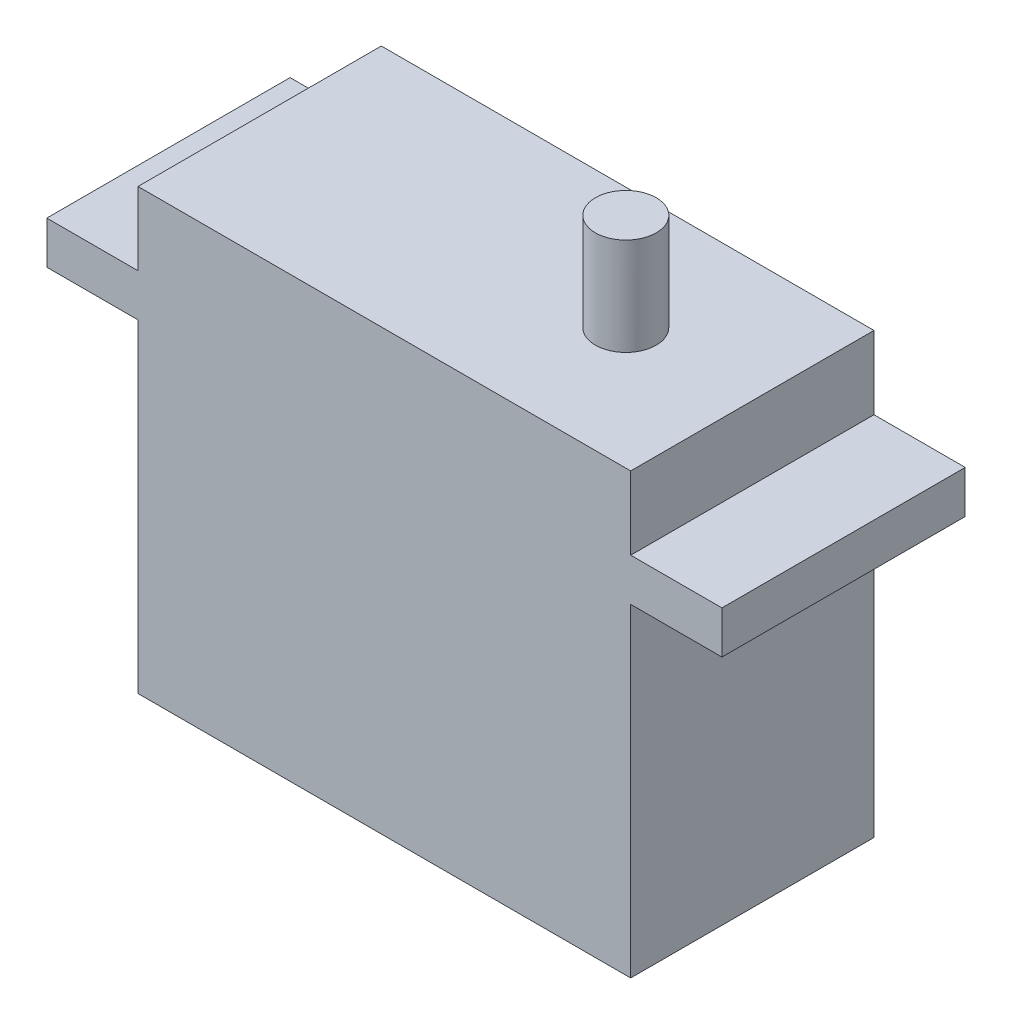
ISO-10303-21;
HEADER;
FILE_DESCRIPTION(('STEP AP214'),'2;1');
FILE_NAME('part.step','',(''),(''),'','','');
FILE_SCHEMA(('AUTOMOTIVE_DESIGN { 1 0 10303 214 1 1 1 1 }'));
ENDSEC;
DATA;
#1=APPLICATION_CONTEXT('core data for automotive mechanical design processes');
#2=APPLICATION_PROTOCOL_DEFINITION('international standard','automotive_design',2000,#1);
#3=PRODUCT_CONTEXT('',#1,'mechanical');
#4=PRODUCT('Part','Part','',(#3));
#5=PRODUCT_RELATED_PRODUCT_CATEGORY('part','',(#4));
#6=PRODUCT_DEFINITION_FORMATION('','',#4);
#7=PRODUCT_DEFINITION_CONTEXT('part definition',#1,'design');
#8=PRODUCT_DEFINITION('design','',#6,#7);
#9=PRODUCT_DEFINITION_SHAPE('','',#8);
#10=(LENGTH_UNIT() NAMED_UNIT(*) SI_UNIT(.MILLI.,.METRE.));
#11=(NAMED_UNIT(*) PLANE_ANGLE_UNIT() SI_UNIT($,.RADIAN.));
#12=(NAMED_UNIT(*) SI_UNIT($,.STERADIAN.) SOLID_ANGLE_UNIT());
#13=UNCERTAINTY_MEASURE_WITH_UNIT(LENGTH_MEASURE(1.E-05),#10,'distance_accuracy_value','');
#14=(GEOMETRIC_REPRESENTATION_CONTEXT(3) GLOBAL_UNCERTAINTY_ASSIGNED_CONTEXT((#13)) GLOBAL_UNIT_ASSIGNED_CONTEXT((#10,
#11,#12)) REPRESENTATION_CONTEXT('',''));
#15=CARTESIAN_POINT('',(0.,0.,0.));
#16=DIRECTION('',(0.,0.,1.));
#17=DIRECTION('',(1.,0.,0.));
#18=AXIS2_PLACEMENT_3D('',#15,#16,#17);
#19=CARTESIAN_POINT('',(-27.75,36.1,10.));
#20=DIRECTION('',(1.,0.,0.));
#21=DIRECTION('',(0.,0.,-1.));
#22=AXIS2_PLACEMENT_3D('',#19,#20,#21);
#23=PLANE('',#22);
#24=DIRECTION('',(0.,0.,1.));
#25=VECTOR('',#24,1.);
#26=CARTESIAN_POINT('',(-27.75,30.1,-10.));
#27=LINE('',#26,#25);
#28=CARTESIAN_POINT('',(-27.75,30.1,-10.));
#29=VERTEX_POINT('',#28);
#30=CARTESIAN_POINT('',(-27.75,30.1,10.));
#31=VERTEX_POINT('',#30);
#32=EDGE_CURVE('E206',#29,#31,#27,.T.);
#33=ORIENTED_EDGE('',*,*,#32,.F.);
#34=DIRECTION('',(0.,-1.,0.));
#35=VECTOR('',#34,1.);
#36=CARTESIAN_POINT('',(-27.75,36.1,-10.));
#37=LINE('',#36,#35);
#38=CARTESIAN_POINT('',(-27.75,26.6,-10.));
#39=VERTEX_POINT('',#38);
#40=EDGE_CURVE('E144',#29,#39,#37,.T.);
#41=ORIENTED_EDGE('',*,*,#40,.T.);
#42=DIRECTION('',(0.,0.,-1.));
#43=VECTOR('',#42,1.);
#44=CARTESIAN_POINT('',(-27.75,26.6,-10.));
#45=LINE('',#44,#43);
#46=CARTESIAN_POINT('',(-27.75,26.6,10.));
#47=VERTEX_POINT('',#46);
#48=EDGE_CURVE('E173',#47,#39,#45,.T.);
#49=ORIENTED_EDGE('',*,*,#48,.F.);
#50=DIRECTION('',(0.,-1.,0.));
#51=VECTOR('',#50,1.);
#52=CARTESIAN_POINT('',(-27.75,36.1,10.));
#53=LINE('',#52,#51);
#54=EDGE_CURVE('E145',#31,#47,#53,.T.);
#55=ORIENTED_EDGE('',*,*,#54,.F.);
#56=EDGE_LOOP('',(#33,#41,#49,#55));
#57=FACE_BOUND('',#56,.T.);
#58=ADVANCED_FACE('F33',(#57),#23,.F.);
#59=CARTESIAN_POINT('',(27.75,36.1,10.));
#60=DIRECTION('',(-1.,0.,0.));
#61=DIRECTION('',(0.,0.,1.));
#62=AXIS2_PLACEMENT_3D('',#59,#60,#61);
#63=PLANE('',#62);
#64=DIRECTION('',(0.,-1.,0.));
#65=VECTOR('',#64,1.);
#66=CARTESIAN_POINT('',(27.75,36.1,-10.));
#67=LINE('',#66,#65);
#68=CARTESIAN_POINT('',(27.75,30.1,-10.));
#69=VERTEX_POINT('',#68);
#70=CARTESIAN_POINT('',(27.75,26.6,-10.));
#71=VERTEX_POINT('',#70);
#72=EDGE_CURVE('E41',#69,#71,#67,.T.);
#73=ORIENTED_EDGE('',*,*,#72,.F.);
#74=DIRECTION('',(0.,0.,-1.));
#75=VECTOR('',#74,1.);
#76=CARTESIAN_POINT('',(27.75,30.1,-10.));
#77=LINE('',#76,#75);
#78=CARTESIAN_POINT('',(27.75,30.1,10.));
#79=VERTEX_POINT('',#78);
#80=EDGE_CURVE('E122',#79,#69,#77,.T.);
#81=ORIENTED_EDGE('',*,*,#80,.F.);
#82=DIRECTION('',(0.,-1.,0.));
#83=VECTOR('',#82,1.);
#84=CARTESIAN_POINT('',(27.75,36.1,10.));
#85=LINE('',#84,#83);
#86=CARTESIAN_POINT('',(27.75,26.6,10.));
#87=VERTEX_POINT('',#86);
#88=EDGE_CURVE('E149',#79,#87,#85,.T.);
#89=ORIENTED_EDGE('',*,*,#88,.T.);
#90=DIRECTION('',(0.,0.,1.));
#91=VECTOR('',#90,1.);
#92=CARTESIAN_POINT('',(27.75,26.6,10.));
#93=LINE('',#92,#91);
#94=EDGE_CURVE('E143',#71,#87,#93,.T.);
#95=ORIENTED_EDGE('',*,*,#94,.F.);
#96=EDGE_LOOP('',(#73,#81,#89,#95));
#97=FACE_BOUND('',#96,.T.);
#98=ADVANCED_FACE('F35',(#97),#63,.F.);
#99=CARTESIAN_POINT('',(-27.75,36.1,-10.));
#100=DIRECTION('',(0.,0.,1.));
#101=DIRECTION('',(1.,0.,0.));
#102=AXIS2_PLACEMENT_3D('',#99,#100,#101);
#103=PLANE('',#102);
#104=DIRECTION('',(-1.,0.,0.));
#105=VECTOR('',#104,1.);
#106=CARTESIAN_POINT('',(-27.75,36.1,-10.));
#107=LINE('',#106,#105);
#108=CARTESIAN_POINT('',(20.25,36.1,-10.));
#109=VERTEX_POINT('',#108);
#110=CARTESIAN_POINT('',(-20.25,36.1,-10.));
#111=VERTEX_POINT('',#110);
#112=EDGE_CURVE('E155',#109,#111,#107,.T.);
#113=ORIENTED_EDGE('',*,*,#112,.F.);
#114=DIRECTION('',(0.,1.,0.));
#115=VECTOR('',#114,1.);
#116=CARTESIAN_POINT('',(20.25,30.1,-10.));
#117=LINE('',#116,#115);
#118=CARTESIAN_POINT('',(20.25,30.1,-10.));
#119=VERTEX_POINT('',#118);
#120=EDGE_CURVE('E56',#119,#109,#117,.T.);
#121=ORIENTED_EDGE('',*,*,#120,.F.);
#122=DIRECTION('',(-1.,0.,0.));
#123=VECTOR('',#122,1.);
#124=CARTESIAN_POINT('',(27.75,30.1,-10.));
#125=LINE('',#124,#123);
#126=EDGE_CURVE('E126',#69,#119,#125,.T.);
#127=ORIENTED_EDGE('',*,*,#126,.F.);
#128=ORIENTED_EDGE('',*,*,#72,.T.);
#129=DIRECTION('',(1.,0.,0.));
#130=VECTOR('',#129,1.);
#131=CARTESIAN_POINT('',(27.75,26.6,-10.));
#132=LINE('',#131,#130);
#133=CARTESIAN_POINT('',(20.25,26.6,-10.));
#134=VERTEX_POINT('',#133);
#135=EDGE_CURVE('E187',#134,#71,#132,.T.);
#136=ORIENTED_EDGE('',*,*,#135,.F.);
#137=DIRECTION('',(0.,-1.,0.));
#138=VECTOR('',#137,1.);
#139=CARTESIAN_POINT('',(20.25,26.6,-10.));
#140=LINE('',#139,#138);
#141=CARTESIAN_POINT('',(20.25,0.,-10.));
#142=VERTEX_POINT('',#141);
#143=EDGE_CURVE('E159',#134,#142,#140,.T.);
#144=ORIENTED_EDGE('',*,*,#143,.T.);
#145=DIRECTION('',(-1.,0.,0.));
#146=VECTOR('',#145,1.);
#147=CARTESIAN_POINT('',(-27.75,0.,-10.));
#148=LINE('',#147,#146);
#149=CARTESIAN_POINT('',(-20.25,0.,-10.));
#150=VERTEX_POINT('',#149);
#151=EDGE_CURVE('E156',#142,#150,#148,.T.);
#152=ORIENTED_EDGE('',*,*,#151,.T.);
#153=DIRECTION('',(0.,-1.,0.));
#154=VECTOR('',#153,1.);
#155=CARTESIAN_POINT('',(-20.25,26.6,-10.));
#156=LINE('',#155,#154);
#157=CARTESIAN_POINT('',(-20.25,26.6,-10.));
#158=VERTEX_POINT('',#157);
#159=EDGE_CURVE('E164',#158,#150,#156,.T.);
#160=ORIENTED_EDGE('',*,*,#159,.F.);
#161=DIRECTION('',(1.,0.,0.));
#162=VECTOR('',#161,1.);
#163=CARTESIAN_POINT('',(-27.75,26.6,-10.));
#164=LINE('',#163,#162);
#165=EDGE_CURVE('E180',#39,#158,#164,.T.);
#166=ORIENTED_EDGE('',*,*,#165,.F.);
#167=ORIENTED_EDGE('',*,*,#40,.F.);
#168=DIRECTION('',(-1.,0.,0.));
#169=VECTOR('',#168,1.);
#170=CARTESIAN_POINT('',(-27.75,30.1,-10.));
#171=LINE('',#170,#169);
#172=CARTESIAN_POINT('',(-20.25,30.1,-10.));
#173=VERTEX_POINT('',#172);
#174=EDGE_CURVE('E201',#173,#29,#171,.T.);
#175=ORIENTED_EDGE('',*,*,#174,.F.);
#176=DIRECTION('',(0.,1.,0.));
#177=VECTOR('',#176,1.);
#178=CARTESIAN_POINT('',(-20.25,30.1,-10.));
#179=LINE('',#178,#177);
#180=EDGE_CURVE('E200',#173,#111,#179,.T.);
#181=ORIENTED_EDGE('',*,*,#180,.T.);
#182=EDGE_LOOP('',(#113,#121,#127,#128,#136,#144,#152,#160,#166,#167,#175,#181));
#183=FACE_BOUND('',#182,.T.);
#184=ADVANCED_FACE('F136',(#183),#103,.F.);
#185=CARTESIAN_POINT('',(-27.75,36.1,10.));
#186=DIRECTION('',(0.,0.,-1.));
#187=DIRECTION('',(-1.,0.,0.));
#188=AXIS2_PLACEMENT_3D('',#185,#186,#187);
#189=PLANE('',#188);
#190=DIRECTION('',(1.,0.,0.));
#191=VECTOR('',#190,1.);
#192=CARTESIAN_POINT('',(27.75,30.1,10.));
#193=LINE('',#192,#191);
#194=CARTESIAN_POINT('',(20.25,30.1,10.));
#195=VERTEX_POINT('',#194);
#196=EDGE_CURVE('E128',#195,#79,#193,.T.);
#197=ORIENTED_EDGE('',*,*,#196,.F.);
#198=DIRECTION('',(0.,1.,0.));
#199=VECTOR('',#198,1.);
#200=CARTESIAN_POINT('',(20.25,30.1,10.));
#201=LINE('',#200,#199);
#202=CARTESIAN_POINT('',(20.25,36.1,10.));
#203=VERTEX_POINT('',#202);
#204=EDGE_CURVE('E174',#195,#203,#201,.T.);
#205=ORIENTED_EDGE('',*,*,#204,.T.);
#206=DIRECTION('',(1.,0.,0.));
#207=VECTOR('',#206,1.);
#208=CARTESIAN_POINT('',(-27.75,36.1,10.));
#209=LINE('',#208,#207);
#210=CARTESIAN_POINT('',(-20.25,36.1,10.));
#211=VERTEX_POINT('',#210);
#212=EDGE_CURVE('E151',#211,#203,#209,.T.);
#213=ORIENTED_EDGE('',*,*,#212,.F.);
#214=DIRECTION('',(0.,1.,0.));
#215=VECTOR('',#214,1.);
#216=CARTESIAN_POINT('',(-20.25,30.1,10.));
#217=LINE('',#216,#215);
#218=CARTESIAN_POINT('',(-20.25,30.1,10.));
#219=VERTEX_POINT('',#218);
#220=EDGE_CURVE('E48',#219,#211,#217,.T.);
#221=ORIENTED_EDGE('',*,*,#220,.F.);
#222=DIRECTION('',(1.,0.,0.));
#223=VECTOR('',#222,1.);
#224=CARTESIAN_POINT('',(-27.75,30.1,10.));
#225=LINE('',#224,#223);
#226=EDGE_CURVE('E212',#31,#219,#225,.T.);
#227=ORIENTED_EDGE('',*,*,#226,.F.);
#228=ORIENTED_EDGE('',*,*,#54,.T.);
#229=DIRECTION('',(-1.,0.,0.));
#230=VECTOR('',#229,1.);
#231=CARTESIAN_POINT('',(-27.75,26.6,10.));
#232=LINE('',#231,#230);
#233=CARTESIAN_POINT('',(-20.25,26.6,10.));
#234=VERTEX_POINT('',#233);
#235=EDGE_CURVE('E167',#234,#47,#232,.T.);
#236=ORIENTED_EDGE('',*,*,#235,.F.);
#237=DIRECTION('',(0.,-1.,0.));
#238=VECTOR('',#237,1.);
#239=CARTESIAN_POINT('',(-20.25,26.6,10.));
#240=LINE('',#239,#238);
#241=CARTESIAN_POINT('',(-20.25,0.,10.));
#242=VERTEX_POINT('',#241);
#243=EDGE_CURVE('E166',#234,#242,#240,.T.);
#244=ORIENTED_EDGE('',*,*,#243,.T.);
#245=DIRECTION('',(1.,0.,0.));
#246=VECTOR('',#245,1.);
#247=CARTESIAN_POINT('',(-27.75,0.,10.));
#248=LINE('',#247,#246);
#249=CARTESIAN_POINT('',(20.25,0.,10.));
#250=VERTEX_POINT('',#249);
#251=EDGE_CURVE('E152',#242,#250,#248,.T.);
#252=ORIENTED_EDGE('',*,*,#251,.T.);
#253=DIRECTION('',(0.,-1.,0.));
#254=VECTOR('',#253,1.);
#255=CARTESIAN_POINT('',(20.25,26.6,10.));
#256=LINE('',#255,#254);
#257=CARTESIAN_POINT('',(20.25,26.6,10.));
#258=VERTEX_POINT('',#257);
#259=EDGE_CURVE('E185',#258,#250,#256,.T.);
#260=ORIENTED_EDGE('',*,*,#259,.F.);
#261=DIRECTION('',(-1.,0.,0.));
#262=VECTOR('',#261,1.);
#263=CARTESIAN_POINT('',(27.75,26.6,10.));
#264=LINE('',#263,#262);
#265=EDGE_CURVE('E195',#87,#258,#264,.T.);
#266=ORIENTED_EDGE('',*,*,#265,.F.);
#267=ORIENTED_EDGE('',*,*,#88,.F.);
#268=EDGE_LOOP('',(#197,#205,#213,#221,#227,#228,#236,#244,#252,#260,#266,#267));
#269=FACE_BOUND('',#268,.T.);
#270=ADVANCED_FACE('F237',(#269),#189,.F.);
#271=CARTESIAN_POINT('',(0.,36.1,0.));
#272=DIRECTION('',(0.,-1.,0.));
#273=DIRECTION('',(0.,0.,-1.));
#274=AXIS2_PLACEMENT_3D('',#271,#272,#273);
#275=PLANE('',#274);
#276=CARTESIAN_POINT('',(9.85,36.1,0.));
#277=DIRECTION('',(0.,-1.,0.));
#278=DIRECTION('',(0.,0.,-1.));
#279=AXIS2_PLACEMENT_3D('',#276,#277,#278);
#280=CIRCLE('',#279,2.5);
#281=CARTESIAN_POINT('',(9.85,36.1,-2.5));
#282=VERTEX_POINT('',#281);
#283=EDGE_CURVE('E11',#282,#282,#280,.F.);
#284=ORIENTED_EDGE('',*,*,#283,.F.);
#285=EDGE_LOOP('',(#284));
#286=FACE_BOUND('',#285,.T.);
#287=ORIENTED_EDGE('',*,*,#212,.T.);
#288=DIRECTION('',(0.,0.,1.));
#289=VECTOR('',#288,1.);
#290=CARTESIAN_POINT('',(20.25,36.1,-10.));
#291=LINE('',#290,#289);
#292=EDGE_CURVE('E132',#109,#203,#291,.T.);
#293=ORIENTED_EDGE('',*,*,#292,.F.);
#294=ORIENTED_EDGE('',*,*,#112,.T.);
#295=DIRECTION('',(0.,0.,-1.));
#296=VECTOR('',#295,1.);
#297=CARTESIAN_POINT('',(-20.25,36.1,-10.));
#298=LINE('',#297,#296);
#299=EDGE_CURVE('E204',#211,#111,#298,.T.);
#300=ORIENTED_EDGE('',*,*,#299,.F.);
#301=EDGE_LOOP('',(#287,#293,#294,#300));
#302=FACE_BOUND('',#301,.T.);
#303=ADVANCED_FACE('F233',(#286,#302),#275,.F.);
#304=CARTESIAN_POINT('',(0.,0.,0.));
#305=DIRECTION('',(0.,-1.,0.));
#306=DIRECTION('',(0.,0.,-1.));
#307=AXIS2_PLACEMENT_3D('',#304,#305,#306);
#308=PLANE('',#307);
#309=DIRECTION('',(0.,0.,-1.));
#310=VECTOR('',#309,1.);
#311=CARTESIAN_POINT('',(20.25,0.,10.));
#312=LINE('',#311,#310);
#313=EDGE_CURVE('E170',#250,#142,#312,.T.);
#314=ORIENTED_EDGE('',*,*,#313,.F.);
#315=ORIENTED_EDGE('',*,*,#251,.F.);
#316=DIRECTION('',(0.,0.,1.));
#317=VECTOR('',#316,1.);
#318=CARTESIAN_POINT('',(-20.25,0.,-10.));
#319=LINE('',#318,#317);
#320=EDGE_CURVE('E171',#150,#242,#319,.T.);
#321=ORIENTED_EDGE('',*,*,#320,.F.);
#322=ORIENTED_EDGE('',*,*,#151,.F.);
#323=EDGE_LOOP('',(#314,#315,#321,#322));
#324=FACE_BOUND('',#323,.T.);
#325=ADVANCED_FACE('F236',(#324),#308,.T.);
#326=CARTESIAN_POINT('',(-20.25,26.6,-10.));
#327=DIRECTION('',(1.,0.,0.));
#328=DIRECTION('',(0.,0.,-1.));
#329=AXIS2_PLACEMENT_3D('',#326,#327,#328);
#330=PLANE('',#329);
#331=ORIENTED_EDGE('',*,*,#320,.T.);
#332=ORIENTED_EDGE('',*,*,#243,.F.);
#333=DIRECTION('',(0.,0.,1.));
#334=VECTOR('',#333,1.);
#335=CARTESIAN_POINT('',(-20.25,26.6,-10.));
#336=LINE('',#335,#334);
#337=EDGE_CURVE('E177',#158,#234,#336,.T.);
#338=ORIENTED_EDGE('',*,*,#337,.F.);
#339=ORIENTED_EDGE('',*,*,#159,.T.);
#340=EDGE_LOOP('',(#331,#332,#338,#339));
#341=FACE_BOUND('',#340,.T.);
#342=ADVANCED_FACE('F282',(#341),#330,.F.);
#343=CARTESIAN_POINT('',(0.,26.6,0.));
#344=DIRECTION('',(0.,1.,0.));
#345=DIRECTION('',(0.,0.,1.));
#346=AXIS2_PLACEMENT_3D('',#343,#344,#345);
#347=PLANE('',#346);
#348=ORIENTED_EDGE('',*,*,#48,.T.);
#349=ORIENTED_EDGE('',*,*,#165,.T.);
#350=ORIENTED_EDGE('',*,*,#337,.T.);
#351=ORIENTED_EDGE('',*,*,#235,.T.);
#352=EDGE_LOOP('',(#348,#349,#350,#351));
#353=FACE_BOUND('',#352,.T.);
#354=ADVANCED_FACE('F289',(#353),#347,.F.);
#355=CARTESIAN_POINT('',(20.25,26.6,10.));
#356=DIRECTION('',(-1.,0.,0.));
#357=DIRECTION('',(0.,0.,1.));
#358=AXIS2_PLACEMENT_3D('',#355,#356,#357);
#359=PLANE('',#358);
#360=ORIENTED_EDGE('',*,*,#313,.T.);
#361=ORIENTED_EDGE('',*,*,#143,.F.);
#362=DIRECTION('',(0.,0.,-1.));
#363=VECTOR('',#362,1.);
#364=CARTESIAN_POINT('',(20.25,26.6,10.));
#365=LINE('',#364,#363);
#366=EDGE_CURVE('E192',#258,#134,#365,.T.);
#367=ORIENTED_EDGE('',*,*,#366,.F.);
#368=ORIENTED_EDGE('',*,*,#259,.T.);
#369=EDGE_LOOP('',(#360,#361,#367,#368));
#370=FACE_BOUND('',#369,.T.);
#371=ADVANCED_FACE('F297',(#370),#359,.F.);
#372=CARTESIAN_POINT('',(0.,26.6,0.));
#373=DIRECTION('',(0.,1.,0.));
#374=DIRECTION('',(0.,0.,1.));
#375=AXIS2_PLACEMENT_3D('',#372,#373,#374);
#376=PLANE('',#375);
#377=ORIENTED_EDGE('',*,*,#94,.T.);
#378=ORIENTED_EDGE('',*,*,#265,.T.);
#379=ORIENTED_EDGE('',*,*,#366,.T.);
#380=ORIENTED_EDGE('',*,*,#135,.T.);
#381=EDGE_LOOP('',(#377,#378,#379,#380));
#382=FACE_BOUND('',#381,.T.);
#383=ADVANCED_FACE('F305',(#382),#376,.F.);
#384=CARTESIAN_POINT('',(-20.25,30.1,-10.));
#385=DIRECTION('',(1.,0.,0.));
#386=DIRECTION('',(0.,0.,-1.));
#387=AXIS2_PLACEMENT_3D('',#384,#385,#386);
#388=PLANE('',#387);
#389=ORIENTED_EDGE('',*,*,#299,.T.);
#390=ORIENTED_EDGE('',*,*,#180,.F.);
#391=DIRECTION('',(0.,0.,-1.));
#392=VECTOR('',#391,1.);
#393=CARTESIAN_POINT('',(-20.25,30.1,-10.));
#394=LINE('',#393,#392);
#395=EDGE_CURVE('E209',#219,#173,#394,.T.);
#396=ORIENTED_EDGE('',*,*,#395,.F.);
#397=ORIENTED_EDGE('',*,*,#220,.T.);
#398=EDGE_LOOP('',(#389,#390,#396,#397));
#399=FACE_BOUND('',#398,.T.);
#400=ADVANCED_FACE('F251',(#399),#388,.F.);
#401=CARTESIAN_POINT('',(0.,30.1,0.));
#402=DIRECTION('',(0.,1.,0.));
#403=DIRECTION('',(0.,0.,1.));
#404=AXIS2_PLACEMENT_3D('',#401,#402,#403);
#405=PLANE('',#404);
#406=ORIENTED_EDGE('',*,*,#32,.T.);
#407=ORIENTED_EDGE('',*,*,#226,.T.);
#408=ORIENTED_EDGE('',*,*,#395,.T.);
#409=ORIENTED_EDGE('',*,*,#174,.T.);
#410=EDGE_LOOP('',(#406,#407,#408,#409));
#411=FACE_BOUND('',#410,.T.);
#412=ADVANCED_FACE('F244',(#411),#405,.T.);
#413=CARTESIAN_POINT('',(20.25,30.1,-10.));
#414=DIRECTION('',(-1.,0.,0.));
#415=DIRECTION('',(0.,0.,1.));
#416=AXIS2_PLACEMENT_3D('',#413,#414,#415);
#417=PLANE('',#416);
#418=ORIENTED_EDGE('',*,*,#292,.T.);
#419=ORIENTED_EDGE('',*,*,#204,.F.);
#420=DIRECTION('',(0.,0.,1.));
#421=VECTOR('',#420,1.);
#422=CARTESIAN_POINT('',(20.25,30.1,-10.));
#423=LINE('',#422,#421);
#424=EDGE_CURVE('E139',#119,#195,#423,.T.);
#425=ORIENTED_EDGE('',*,*,#424,.F.);
#426=ORIENTED_EDGE('',*,*,#120,.T.);
#427=EDGE_LOOP('',(#418,#419,#425,#426));
#428=FACE_BOUND('',#427,.T.);
#429=ADVANCED_FACE('F242',(#428),#417,.F.);
#430=CARTESIAN_POINT('',(0.,30.1,0.));
#431=DIRECTION('',(0.,-1.,0.));
#432=DIRECTION('',(0.,0.,-1.));
#433=AXIS2_PLACEMENT_3D('',#430,#431,#432);
#434=PLANE('',#433);
#435=ORIENTED_EDGE('',*,*,#80,.T.);
#436=ORIENTED_EDGE('',*,*,#126,.T.);
#437=ORIENTED_EDGE('',*,*,#424,.T.);
#438=ORIENTED_EDGE('',*,*,#196,.T.);
#439=EDGE_LOOP('',(#435,#436,#437,#438));
#440=FACE_BOUND('',#439,.T.);
#441=ADVANCED_FACE('F124',(#440),#434,.F.);
#442=CARTESIAN_POINT('',(9.85,44.1,0.));
#443=DIRECTION('',(0.,-1.,0.));
#444=DIRECTION('',(0.,0.,-1.));
#445=AXIS2_PLACEMENT_3D('',#442,#443,#444);
#446=CYLINDRICAL_SURFACE('',#445,2.5);
#447=CARTESIAN_POINT('',(9.85,44.1,0.));
#448=DIRECTION('',(0.,1.,0.));
#449=DIRECTION('',(0.,0.,1.));
#450=AXIS2_PLACEMENT_3D('',#447,#448,#449);
#451=CIRCLE('',#450,2.5);
#452=CARTESIAN_POINT('',(9.85,44.1,2.5));
#453=VERTEX_POINT('',#452);
#454=EDGE_CURVE('E207',#453,#453,#451,.T.);
#455=ORIENTED_EDGE('',*,*,#454,.F.);
#456=EDGE_LOOP('',(#455));
#457=FACE_BOUND('',#456,.T.);
#458=ORIENTED_EDGE('',*,*,#283,.T.);
#459=EDGE_LOOP('',(#458));
#460=FACE_BOUND('',#459,.T.);
#461=ADVANCED_FACE('F227',(#457,#460),#446,.T.);
#462=CARTESIAN_POINT('',(9.85,44.1,0.));
#463=DIRECTION('',(0.,1.,0.));
#464=DIRECTION('',(0.,0.,1.));
#465=AXIS2_PLACEMENT_3D('',#462,#463,#464);
#466=PLANE('',#465);
#467=ORIENTED_EDGE('',*,*,#454,.T.);
#468=EDGE_LOOP('',(#467));
#469=FACE_BOUND('',#468,.T.);
#470=ADVANCED_FACE('F225',(#469),#466,.T.);
#471=CLOSED_SHELL('',(#58,#98,#184,#270,#303,#325,#342,#354,#371,#383,#400,#412,#429,#441,#461,#470));
#472=MANIFOLD_SOLID_BREP('B2',#471);
#473=ADVANCED_BREP_SHAPE_REPRESENTATION('',(#18,#472),#14);
#474=SHAPE_DEFINITION_REPRESENTATION(#9,#473);
ENDSEC;
END-ISO-10303-21;
